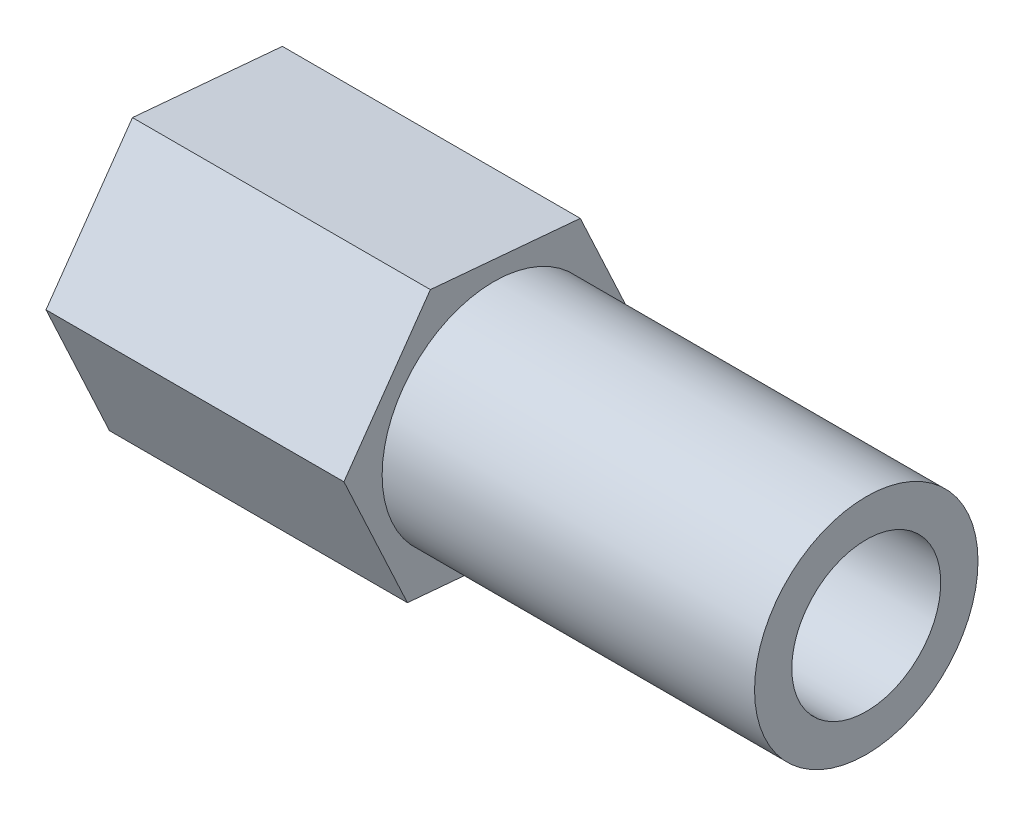
ISO-10303-21;
HEADER;
FILE_DESCRIPTION(('STEP AP214'),'2;1');
FILE_NAME('part.step','',(''),(''),'','','');
FILE_SCHEMA(('AUTOMOTIVE_DESIGN { 1 0 10303 214 1 1 1 1 }'));
ENDSEC;
DATA;
#1=APPLICATION_CONTEXT('core data for automotive mechanical design processes');
#2=APPLICATION_PROTOCOL_DEFINITION('international standard','automotive_design',2000,#1);
#3=PRODUCT_CONTEXT('',#1,'mechanical');
#4=PRODUCT('Part','Part','',(#3));
#5=PRODUCT_RELATED_PRODUCT_CATEGORY('part','',(#4));
#6=PRODUCT_DEFINITION_FORMATION('','',#4);
#7=PRODUCT_DEFINITION_CONTEXT('part definition',#1,'design');
#8=PRODUCT_DEFINITION('design','',#6,#7);
#9=PRODUCT_DEFINITION_SHAPE('','',#8);
#10=(LENGTH_UNIT() NAMED_UNIT(*) SI_UNIT(.MILLI.,.METRE.));
#11=(NAMED_UNIT(*) PLANE_ANGLE_UNIT() SI_UNIT($,.RADIAN.));
#12=(NAMED_UNIT(*) SI_UNIT($,.STERADIAN.) SOLID_ANGLE_UNIT());
#13=UNCERTAINTY_MEASURE_WITH_UNIT(LENGTH_MEASURE(1.E-05),#10,'distance_accuracy_value','');
#14=(GEOMETRIC_REPRESENTATION_CONTEXT(3) GLOBAL_UNCERTAINTY_ASSIGNED_CONTEXT((#13)) GLOBAL_UNIT_ASSIGNED_CONTEXT((#10,
#11,#12)) REPRESENTATION_CONTEXT('',''));
#15=CARTESIAN_POINT('',(0.,0.,0.));
#16=DIRECTION('',(0.,0.,1.));
#17=DIRECTION('',(1.,0.,0.));
#18=AXIS2_PLACEMENT_3D('',#15,#16,#17);
#19=CARTESIAN_POINT('',(8.,0.,0.));
#20=DIRECTION('',(1.,0.,0.));
#21=DIRECTION('',(0.,0.,-1.));
#22=AXIS2_PLACEMENT_3D('',#19,#20,#21);
#23=PLANE('',#22);
#24=DIRECTION('',(0.,-0.0881213424994462,-0.996109747465657));
#25=VECTOR('',#24,1.);
#26=CARTESIAN_POINT('',(8.,-3.30831503328289,2.32128950669405));
#27=LINE('',#26,#25);
#28=CARTESIAN_POINT('',(8.,-3.30831503328289,2.32128950669405));
#29=VERTEX_POINT('',#28);
#30=CARTESIAN_POINT('',(8.,-3.66445319897674,-1.70444010919791));
#31=VERTEX_POINT('',#30);
#32=EDGE_CURVE('E136',#29,#31,#27,.T.);
#33=ORIENTED_EDGE('',*,*,#32,.T.);
#34=DIRECTION('',(0.,0.818595675012837,-0.574370194952939));
#35=VECTOR('',#34,1.);
#36=CARTESIAN_POINT('',(8.,-3.66445319897674,-1.70444010919791));
#37=LINE('',#36,#35);
#38=CARTESIAN_POINT('',(8.,-0.356138165693851,-4.02572961589196));
#39=VERTEX_POINT('',#38);
#40=EDGE_CURVE('E94',#31,#39,#37,.T.);
#41=ORIENTED_EDGE('',*,*,#40,.T.);
#42=DIRECTION('',(0.,0.906717017512285,0.421739552512718));
#43=VECTOR('',#42,1.);
#44=CARTESIAN_POINT('',(8.,-0.356138165693851,-4.02572961589196));
#45=LINE('',#44,#43);
#46=CARTESIAN_POINT('',(8.,3.30831503328289,-2.32128950669404));
#47=VERTEX_POINT('',#46);
#48=EDGE_CURVE('E107',#39,#47,#45,.T.);
#49=ORIENTED_EDGE('',*,*,#48,.T.);
#50=DIRECTION('',(0.,0.0881213424994472,0.996109747465657));
#51=VECTOR('',#50,1.);
#52=CARTESIAN_POINT('',(8.,3.30831503328289,-2.32128950669404));
#53=LINE('',#52,#51);
#54=CARTESIAN_POINT('',(8.,3.66445319897674,1.70444010919791));
#55=VERTEX_POINT('',#54);
#56=EDGE_CURVE('E101',#47,#55,#53,.T.);
#57=ORIENTED_EDGE('',*,*,#56,.T.);
#58=DIRECTION('',(0.,-0.818595675012837,0.574370194952939));
#59=VECTOR('',#58,1.);
#60=CARTESIAN_POINT('',(8.,3.66445319897674,1.70444010919791));
#61=LINE('',#60,#59);
#62=CARTESIAN_POINT('',(8.,0.35613816569385,4.02572961589196));
#63=VERTEX_POINT('',#62);
#64=EDGE_CURVE('E105',#55,#63,#61,.T.);
#65=ORIENTED_EDGE('',*,*,#64,.T.);
#66=DIRECTION('',(0.,-0.906717017512285,-0.421739552512718));
#67=VECTOR('',#66,1.);
#68=CARTESIAN_POINT('',(8.,0.35613816569385,4.02572961589196));
#69=LINE('',#68,#67);
#70=EDGE_CURVE('E57',#63,#29,#69,.T.);
#71=ORIENTED_EDGE('',*,*,#70,.T.);
#72=EDGE_LOOP('',(#33,#41,#49,#57,#65,#71));
#73=FACE_BOUND('',#72,.T.);
#74=CARTESIAN_POINT('',(8.,0.,0.));
#75=DIRECTION('',(1.,0.,0.));
#76=DIRECTION('',(0.,0.,-1.));
#77=AXIS2_PLACEMENT_3D('',#74,#75,#76);
#78=CIRCLE('',#77,3.);
#79=CARTESIAN_POINT('',(8.,0.,-3.));
#80=VERTEX_POINT('',#79);
#81=EDGE_CURVE('E203',#80,#80,#78,.T.);
#82=ORIENTED_EDGE('',*,*,#81,.F.);
#83=EDGE_LOOP('',(#82));
#84=FACE_BOUND('',#83,.T.);
#85=ADVANCED_FACE('F35',(#73,#84),#23,.T.);
#86=CARTESIAN_POINT('',(8.,-3.30831503328289,2.32128950669405));
#87=DIRECTION('',(0.,0.996109747465657,-0.0881213424994462));
#88=DIRECTION('',(0.,0.0881213424994462,0.996109747465657));
#89=AXIS2_PLACEMENT_3D('',#86,#87,#88);
#90=PLANE('',#89);
#91=DIRECTION('',(0.,-0.0881213424994462,-0.996109747465657));
#92=VECTOR('',#91,1.);
#93=CARTESIAN_POINT('',(0.,-3.30831503328289,2.32128950669405));
#94=LINE('',#93,#92);
#95=CARTESIAN_POINT('',(0.,-3.30831503328289,2.32128950669405));
#96=VERTEX_POINT('',#95);
#97=CARTESIAN_POINT('',(0.,-3.66445319897674,-1.70444010919791));
#98=VERTEX_POINT('',#97);
#99=EDGE_CURVE('E125',#96,#98,#94,.T.);
#100=ORIENTED_EDGE('',*,*,#99,.T.);
#101=DIRECTION('',(-1.,0.,0.));
#102=VECTOR('',#101,1.);
#103=CARTESIAN_POINT('',(8.,-3.66445319897674,-1.70444010919791));
#104=LINE('',#103,#102);
#105=EDGE_CURVE('E11',#31,#98,#104,.T.);
#106=ORIENTED_EDGE('',*,*,#105,.F.);
#107=ORIENTED_EDGE('',*,*,#32,.F.);
#108=DIRECTION('',(-1.,0.,0.));
#109=VECTOR('',#108,1.);
#110=CARTESIAN_POINT('',(8.,-3.30831503328289,2.32128950669405));
#111=LINE('',#110,#109);
#112=EDGE_CURVE('E121',#29,#96,#111,.T.);
#113=ORIENTED_EDGE('',*,*,#112,.T.);
#114=EDGE_LOOP('',(#100,#106,#107,#113));
#115=FACE_BOUND('',#114,.T.);
#116=ADVANCED_FACE('F37',(#115),#90,.F.);
#117=CARTESIAN_POINT('',(8.,-3.66445319897674,-1.70444010919791));
#118=DIRECTION('',(0.,0.574370194952939,0.818595675012837));
#119=DIRECTION('',(0.,-0.818595675012837,0.574370194952939));
#120=AXIS2_PLACEMENT_3D('',#117,#118,#119);
#121=PLANE('',#120);
#122=DIRECTION('',(0.,0.818595675012837,-0.574370194952939));
#123=VECTOR('',#122,1.);
#124=CARTESIAN_POINT('',(0.,-3.66445319897674,-1.70444010919791));
#125=LINE('',#124,#123);
#126=CARTESIAN_POINT('',(0.,-0.356138165693851,-4.02572961589196));
#127=VERTEX_POINT('',#126);
#128=EDGE_CURVE('E128',#98,#127,#125,.T.);
#129=ORIENTED_EDGE('',*,*,#128,.T.);
#130=DIRECTION('',(-1.,0.,0.));
#131=VECTOR('',#130,1.);
#132=CARTESIAN_POINT('',(8.,-0.356138165693851,-4.02572961589196));
#133=LINE('',#132,#131);
#134=EDGE_CURVE('E49',#39,#127,#133,.T.);
#135=ORIENTED_EDGE('',*,*,#134,.F.);
#136=ORIENTED_EDGE('',*,*,#40,.F.);
#137=ORIENTED_EDGE('',*,*,#105,.T.);
#138=EDGE_LOOP('',(#129,#135,#136,#137));
#139=FACE_BOUND('',#138,.T.);
#140=ADVANCED_FACE('F166',(#139),#121,.F.);
#141=CARTESIAN_POINT('',(8.,-0.356138165693851,-4.02572961589196));
#142=DIRECTION('',(0.,-0.421739552512718,0.906717017512285));
#143=DIRECTION('',(0.,-0.906717017512285,-0.421739552512718));
#144=AXIS2_PLACEMENT_3D('',#141,#142,#143);
#145=PLANE('',#144);
#146=DIRECTION('',(0.,0.906717017512285,0.421739552512718));
#147=VECTOR('',#146,1.);
#148=CARTESIAN_POINT('',(0.,-0.356138165693851,-4.02572961589196));
#149=LINE('',#148,#147);
#150=CARTESIAN_POINT('',(0.,3.30831503328289,-2.32128950669404));
#151=VERTEX_POINT('',#150);
#152=EDGE_CURVE('E131',#127,#151,#149,.T.);
#153=ORIENTED_EDGE('',*,*,#152,.T.);
#154=DIRECTION('',(-1.,0.,0.));
#155=VECTOR('',#154,1.);
#156=CARTESIAN_POINT('',(8.,3.30831503328289,-2.32128950669404));
#157=LINE('',#156,#155);
#158=EDGE_CURVE('E116',#47,#151,#157,.T.);
#159=ORIENTED_EDGE('',*,*,#158,.F.);
#160=ORIENTED_EDGE('',*,*,#48,.F.);
#161=ORIENTED_EDGE('',*,*,#134,.T.);
#162=EDGE_LOOP('',(#153,#159,#160,#161));
#163=FACE_BOUND('',#162,.T.);
#164=ADVANCED_FACE('F143',(#163),#145,.F.);
#165=CARTESIAN_POINT('',(8.,3.30831503328289,-2.32128950669404));
#166=DIRECTION('',(0.,-0.996109747465657,0.0881213424994472));
#167=DIRECTION('',(0.,-0.0881213424994472,-0.996109747465657));
#168=AXIS2_PLACEMENT_3D('',#165,#166,#167);
#169=PLANE('',#168);
#170=DIRECTION('',(0.,0.0881213424994472,0.996109747465657));
#171=VECTOR('',#170,1.);
#172=CARTESIAN_POINT('',(0.,3.30831503328289,-2.32128950669404));
#173=LINE('',#172,#171);
#174=CARTESIAN_POINT('',(0.,3.66445319897674,1.70444010919791));
#175=VERTEX_POINT('',#174);
#176=EDGE_CURVE('E115',#151,#175,#173,.T.);
#177=ORIENTED_EDGE('',*,*,#176,.T.);
#178=DIRECTION('',(-1.,0.,0.));
#179=VECTOR('',#178,1.);
#180=CARTESIAN_POINT('',(8.,3.66445319897674,1.70444010919791));
#181=LINE('',#180,#179);
#182=EDGE_CURVE('E112',#55,#175,#181,.T.);
#183=ORIENTED_EDGE('',*,*,#182,.F.);
#184=ORIENTED_EDGE('',*,*,#56,.F.);
#185=ORIENTED_EDGE('',*,*,#158,.T.);
#186=EDGE_LOOP('',(#177,#183,#184,#185));
#187=FACE_BOUND('',#186,.T.);
#188=ADVANCED_FACE('F113',(#187),#169,.F.);
#189=CARTESIAN_POINT('',(8.,3.66445319897674,1.70444010919791));
#190=DIRECTION('',(0.,-0.574370194952939,-0.818595675012837));
#191=DIRECTION('',(0.,0.818595675012837,-0.574370194952939));
#192=AXIS2_PLACEMENT_3D('',#189,#190,#191);
#193=PLANE('',#192);
#194=DIRECTION('',(0.,-0.818595675012837,0.574370194952939));
#195=VECTOR('',#194,1.);
#196=CARTESIAN_POINT('',(0.,3.66445319897674,1.70444010919791));
#197=LINE('',#196,#195);
#198=CARTESIAN_POINT('',(0.,0.35613816569385,4.02572961589196));
#199=VERTEX_POINT('',#198);
#200=EDGE_CURVE('E80',#175,#199,#197,.T.);
#201=ORIENTED_EDGE('',*,*,#200,.T.);
#202=DIRECTION('',(-1.,0.,0.));
#203=VECTOR('',#202,1.);
#204=CARTESIAN_POINT('',(8.,0.35613816569385,4.02572961589196));
#205=LINE('',#204,#203);
#206=EDGE_CURVE('E117',#63,#199,#205,.T.);
#207=ORIENTED_EDGE('',*,*,#206,.F.);
#208=ORIENTED_EDGE('',*,*,#64,.F.);
#209=ORIENTED_EDGE('',*,*,#182,.T.);
#210=EDGE_LOOP('',(#201,#207,#208,#209));
#211=FACE_BOUND('',#210,.T.);
#212=ADVANCED_FACE('F119',(#211),#193,.F.);
#213=CARTESIAN_POINT('',(8.,0.35613816569385,4.02572961589196));
#214=DIRECTION('',(0.,0.421739552512718,-0.906717017512285));
#215=DIRECTION('',(0.,0.906717017512285,0.421739552512718));
#216=AXIS2_PLACEMENT_3D('',#213,#214,#215);
#217=PLANE('',#216);
#218=DIRECTION('',(0.,-0.906717017512285,-0.421739552512718));
#219=VECTOR('',#218,1.);
#220=CARTESIAN_POINT('',(0.,0.35613816569385,4.02572961589196));
#221=LINE('',#220,#219);
#222=EDGE_CURVE('E86',#199,#96,#221,.T.);
#223=ORIENTED_EDGE('',*,*,#222,.T.);
#224=ORIENTED_EDGE('',*,*,#112,.F.);
#225=ORIENTED_EDGE('',*,*,#70,.F.);
#226=ORIENTED_EDGE('',*,*,#206,.T.);
#227=EDGE_LOOP('',(#223,#224,#225,#226));
#228=FACE_BOUND('',#227,.T.);
#229=ADVANCED_FACE('F150',(#228),#217,.F.);
#230=CARTESIAN_POINT('',(0.,0.,0.));
#231=DIRECTION('',(1.,0.,0.));
#232=DIRECTION('',(0.,0.,-1.));
#233=AXIS2_PLACEMENT_3D('',#230,#231,#232);
#234=PLANE('',#233);
#235=CARTESIAN_POINT('',(0.,0.,0.));
#236=DIRECTION('',(-1.,0.,0.));
#237=DIRECTION('',(0.,0.,1.));
#238=AXIS2_PLACEMENT_3D('',#235,#236,#237);
#239=CIRCLE('',#238,2.);
#240=CARTESIAN_POINT('',(0.,0.,2.));
#241=VERTEX_POINT('',#240);
#242=EDGE_CURVE('E179',#241,#241,#239,.T.);
#243=ORIENTED_EDGE('',*,*,#242,.F.);
#244=EDGE_LOOP('',(#243));
#245=FACE_BOUND('',#244,.T.);
#246=ORIENTED_EDGE('',*,*,#99,.F.);
#247=ORIENTED_EDGE('',*,*,#222,.F.);
#248=ORIENTED_EDGE('',*,*,#200,.F.);
#249=ORIENTED_EDGE('',*,*,#176,.F.);
#250=ORIENTED_EDGE('',*,*,#152,.F.);
#251=ORIENTED_EDGE('',*,*,#128,.F.);
#252=EDGE_LOOP('',(#246,#247,#248,#249,#250,#251));
#253=FACE_BOUND('',#252,.T.);
#254=ADVANCED_FACE('F146',(#245,#253),#234,.F.);
#255=CARTESIAN_POINT('',(18.,0.,0.));
#256=DIRECTION('',(-1.,0.,0.));
#257=DIRECTION('',(0.,0.,1.));
#258=AXIS2_PLACEMENT_3D('',#255,#256,#257);
#259=CYLINDRICAL_SURFACE('',#258,3.);
#260=CARTESIAN_POINT('',(14.5783428836509,0.,-3.));
#261=CARTESIAN_POINT('',(14.5783379301751,0.0788579444268503,-2.99999570107562));
#262=CARTESIAN_POINT('',(14.5720877739693,0.157809899546344,-2.99685736529635));
#263=CARTESIAN_POINT('',(14.5473635631385,0.313380352903344,-2.98461234055736));
#264=CARTESIAN_POINT('',(14.5288662941541,0.389994130070445,-2.97549431743379));
#265=CARTESIAN_POINT('',(14.4805521707259,0.538400317320674,-2.95224419105063));
#266=CARTESIAN_POINT('',(14.4507793072789,0.61021020440872,-2.93813158766306));
#267=CARTESIAN_POINT('',(14.3809869516034,0.747708925209899,-2.90618664773642));
#268=CARTESIAN_POINT('',(14.3409682672776,0.813398240985089,-2.88835460450288));
#269=CARTESIAN_POINT('',(14.2490670094229,0.941261726642864,-2.84934387387093));
#270=CARTESIAN_POINT('',(14.1966131647914,1.00298281668316,-2.82802798691306));
#271=CARTESIAN_POINT('',(14.0825606647803,1.11716916730047,-2.78489955370114));
#272=CARTESIAN_POINT('',(14.0209551059922,1.16962737466015,-2.76308664313552));
#273=CARTESIAN_POINT('',(13.8846178593658,1.26787800067542,-2.71948426796021));
#274=CARTESIAN_POINT('',(13.809238736132,1.31283800332746,-2.69782780455198));
#275=CARTESIAN_POINT('',(13.6507918796715,1.38925234033604,-2.65928968158481));
#276=CARTESIAN_POINT('',(13.5677296905667,1.4207163224495,-2.64240461410484));
#277=CARTESIAN_POINT('',(13.401345225518,1.46719866328288,-2.61686800556713));
#278=CARTESIAN_POINT('',(13.3183362055498,1.48308878562066,-2.6077840737557));
#279=CARTESIAN_POINT('',(13.1503746269816,1.50064048996327,-2.59772834922792));
#280=CARTESIAN_POINT('',(13.0654240723441,1.50231613255961,-2.59674854014932));
#281=CARTESIAN_POINT('',(12.9069138471778,1.49203093075844,-2.60266395385873));
#282=CARTESIAN_POINT('',(12.8332068368163,1.48167683930523,-2.6086314549302));
#283=CARTESIAN_POINT('',(12.6887600195913,1.4504097735854,-2.62614343100775));
#284=CARTESIAN_POINT('',(12.6180211656929,1.42949343584648,-2.63768968247664));
#285=CARTESIAN_POINT('',(12.4794991848024,1.37731467057901,-2.66531214619112));
#286=CARTESIAN_POINT('',(12.4118232854722,1.34582260067399,-2.68148760995998));
#287=CARTESIAN_POINT('',(12.2823914447658,1.273562531502,-2.71655106422106));
#288=CARTESIAN_POINT('',(12.2206381802507,1.2327903657187,-2.73544027170286));
#289=CARTESIAN_POINT('',(12.096561004536,1.13709908236918,-2.77669736854929));
#290=CARTESIAN_POINT('',(12.0351575732866,1.08104168755392,-2.79920265355119));
#291=CARTESIAN_POINT('',(11.9222397557645,0.95933336811206,-2.84321434950611));
#292=CARTESIAN_POINT('',(11.8707300956,0.893677884861428,-2.86472027938201));
#293=CARTESIAN_POINT('',(11.7768143921063,0.750774758747772,-2.90552980924446));
#294=CARTESIAN_POINT('',(11.7349421749822,0.673130387399113,-2.92468476243011));
#295=CARTESIAN_POINT('',(11.6651973400863,0.510699323233195,-2.95736821681863));
#296=CARTESIAN_POINT('',(11.6373136061281,0.425918364397914,-2.9709011841533));
#297=CARTESIAN_POINT('',(11.5986297780758,0.259149737491053,-2.98986500612153));
#298=CARTESIAN_POINT('',(11.5866060300307,0.177512295822489,-2.99587407451965));
#299=CARTESIAN_POINT('',(11.5761457869491,0.0131693999240273,-3.00109520188655));
#300=CARTESIAN_POINT('',(11.5777028551916,-0.0695355298048631,-3.00031048081978));
#301=CARTESIAN_POINT('',(11.593652916279,-0.22684945797898,-2.99236788380152));
#302=CARTESIAN_POINT('',(11.6070416827458,-0.301589112074894,-2.98570868532253));
#303=CARTESIAN_POINT('',(11.6446999914935,-0.447610338452911,-2.9673325697226));
#304=CARTESIAN_POINT('',(11.6689707333311,-0.51889152853663,-2.95561509501618));
#305=CARTESIAN_POINT('',(11.7283405833004,-0.658332912674359,-2.92776377120382));
#306=CARTESIAN_POINT('',(11.7637294588253,-0.726345595508705,-2.91151322654446));
#307=CARTESIAN_POINT('',(11.8440041871207,-0.855692042548907,-2.87615961476126));
#308=CARTESIAN_POINT('',(11.8888940855439,-0.917022944664887,-2.85705533350407));
#309=CARTESIAN_POINT('',(11.9919835216469,-1.03765153393382,-2.81562332004297));
#310=CARTESIAN_POINT('',(12.0510571863186,-1.09615811672854,-2.79316327265249));
#311=CARTESIAN_POINT('',(12.1782306105674,-1.20278448167828,-2.7489358741323));
#312=CARTESIAN_POINT('',(12.2463365619227,-1.25089707856781,-2.72716901100071));
#313=CARTESIAN_POINT('',(12.3938083649103,-1.33756187171853,-2.68576788309734));
#314=CARTESIAN_POINT('',(12.4735597827926,-1.37553824370037,-2.66628794383591));
#315=CARTESIAN_POINT('',(12.6396079850133,-1.43712423890206,-2.63361108441202));
#316=CARTESIAN_POINT('',(12.7258961733512,-1.46075237380052,-2.62040607332625));
#317=CARTESIAN_POINT('',(12.8937082179779,-1.49079253120031,-2.60342251538703));
#318=CARTESIAN_POINT('',(12.9748942638037,-1.49863949460818,-2.59886075197597));
#319=CARTESIAN_POINT('',(13.1375134843976,-1.5010337315643,-2.59748031962405));
#320=CARTESIAN_POINT('',(13.2189465367576,-1.49558676993486,-2.60065829439585));
#321=CARTESIAN_POINT('',(13.371568135951,-1.47288918838997,-2.61356793076615));
#322=CARTESIAN_POINT('',(13.442993588868,-1.45681247151455,-2.62264641723988));
#323=CARTESIAN_POINT('',(13.5820550627874,-1.41476303733662,-2.64556524281479));
#324=CARTESIAN_POINT('',(13.6496898567889,-1.38878713673988,-2.65940711354503));
#325=CARTESIAN_POINT('',(13.7842801601307,-1.32572361795085,-2.69142795546803));
#326=CARTESIAN_POINT('',(13.8508847363944,-1.28800670672355,-2.70983583593881));
#327=CARTESIAN_POINT('',(13.9772546879227,-1.20322645745609,-2.74852997452291));
#328=CARTESIAN_POINT('',(14.0370164794325,-1.15615825686234,-2.76881720693416));
#329=CARTESIAN_POINT('',(14.1555558571829,-1.04730498999206,-2.81193484737138));
#330=CARTESIAN_POINT('',(14.2133315371763,-0.984426634495894,-2.83477474959942));
#331=CARTESIAN_POINT('',(14.3177373588038,-0.849232209349798,-2.87816628389896));
#332=CARTESIAN_POINT('',(14.3643614928557,-0.776911084957797,-2.89871667939293));
#333=CARTESIAN_POINT('',(14.445197427719,-0.62389739517442,-2.93547014349806));
#334=CARTESIAN_POINT('',(14.4793191375056,-0.543149255665097,-2.95164144740899));
#335=CARTESIAN_POINT('',(14.533055135287,-0.376113151707131,-2.9775201194848));
#336=CARTESIAN_POINT('',(14.5527106538594,-0.289841699383651,-2.98724585044602));
#337=CARTESIAN_POINT('',(14.5691890002795,-0.168902919736344,-2.99543192870217));
#338=CARTESIAN_POINT('',(14.5726168449504,-0.135242819162348,-2.99714048010376));
#339=CARTESIAN_POINT('',(14.577194881922,-0.0677275977076378,-2.99942545465223));
#340=CARTESIAN_POINT('',(14.5783450113562,-0.0338724714699429,-3.00000184655071));
#341=CARTESIAN_POINT('',(14.5783428836509,0.,-3.));
#342=B_SPLINE_CURVE_WITH_KNOTS('',3,(#260,#261,#262,#263,#264,#265,#266,#267,#268,#269,#270,
#271,#272,#273,#274,#275,#276,#277,#278,#279,#280,#281,#282,#283,#284,#285,#286,#287,#288,#289,
#290,#291,#292,#293,#294,#295,#296,#297,#298,#299,#300,#301,#302,#303,#304,#305,#306,#307,#308,
#309,#310,#311,#312,#313,#314,#315,#316,#317,#318,#319,#320,#321,#322,#323,#324,#325,#326,#327,
#328,#329,#330,#331,#332,#333,#334,#335,#336,#337,#338,#339,#340,#341),.UNSPECIFIED.,.T.,.F.,(4,
2,2,2,2,2,2,2,2,2,2,2,2,2,2,2,2,2,2,2,2,2,2,2,2,2,2,2,2,2,2,2,2,2,2,2,2,2,2,2,4),(0.,
0.236436386130439,0.473322224563797,0.709293233238449,0.945245640872352,1.19547263807713,
1.44588935648105,1.71572589646129,1.98536921847421,2.23887018210344,2.49212035993531,
2.71508568613981,2.93812205888518,3.16635360252731,3.39468781890333,3.65197412000818,
3.9093830189803,4.17874533321661,4.44789325368419,4.69474935707018,4.94148846767214,
5.16910359759183,5.39674382446397,5.63089284041848,5.86514176122509,6.12239415966628,
6.37982382923148,6.64972023242589,6.91926767918176,7.1629396125457,7.40650589797017,
7.62686895373283,7.84730293182526,8.0825468517043,8.31791341715446,8.58187864135757,
8.84598575071868,9.1119602049529,9.37717362931724,9.47872920200875,9.58028757766599),.UNSPECIFIED.);
#343=CARTESIAN_POINT('',(14.5783428836509,0.,-3.));
#344=VERTEX_POINT('',#343);
#345=EDGE_CURVE('E174',#344,#344,#342,.T.);
#346=ORIENTED_EDGE('',*,*,#345,.T.);
#347=EDGE_LOOP('',(#346));
#348=FACE_BOUND('',#347,.T.);
#349=CARTESIAN_POINT('',(18.,0.,0.));
#350=DIRECTION('',(1.,0.,0.));
#351=DIRECTION('',(0.,0.,-1.));
#352=AXIS2_PLACEMENT_3D('',#349,#350,#351);
#353=CIRCLE('',#352,3.);
#354=CARTESIAN_POINT('',(18.,0.,-3.));
#355=VERTEX_POINT('',#354);
#356=EDGE_CURVE('E129',#355,#355,#353,.T.);
#357=ORIENTED_EDGE('',*,*,#356,.F.);
#358=EDGE_LOOP('',(#357));
#359=FACE_BOUND('',#358,.T.);
#360=ORIENTED_EDGE('',*,*,#81,.T.);
#361=EDGE_LOOP('',(#360));
#362=FACE_BOUND('',#361,.T.);
#363=ADVANCED_FACE('F157',(#348,#359,#362),#259,.T.);
#364=CARTESIAN_POINT('',(18.,0.,0.));
#365=DIRECTION('',(1.,0.,0.));
#366=DIRECTION('',(0.,0.,-1.));
#367=AXIS2_PLACEMENT_3D('',#364,#365,#366);
#368=PLANE('',#367);
#369=CARTESIAN_POINT('',(18.,0.,0.));
#370=DIRECTION('',(-1.,0.,0.));
#371=DIRECTION('',(0.,0.,1.));
#372=AXIS2_PLACEMENT_3D('',#369,#370,#371);
#373=CIRCLE('',#372,2.);
#374=CARTESIAN_POINT('',(18.,0.,2.));
#375=VERTEX_POINT('',#374);
#376=EDGE_CURVE('E180',#375,#375,#373,.T.);
#377=ORIENTED_EDGE('',*,*,#376,.T.);
#378=EDGE_LOOP('',(#377));
#379=FACE_BOUND('',#378,.T.);
#380=ORIENTED_EDGE('',*,*,#356,.T.);
#381=EDGE_LOOP('',(#380));
#382=FACE_BOUND('',#381,.T.);
#383=ADVANCED_FACE('F171',(#379,#382),#368,.T.);
#384=CARTESIAN_POINT('',(18.,0.,0.));
#385=DIRECTION('',(-1.,0.,0.));
#386=DIRECTION('',(0.,0.,1.));
#387=AXIS2_PLACEMENT_3D('',#384,#385,#386);
#388=CYLINDRICAL_SURFACE('',#387,2.);
#389=CARTESIAN_POINT('',(14.5783428836509,0.,-2.));
#390=CARTESIAN_POINT('',(14.5783380916388,-0.0732207358411543,-1.99999540196395));
#391=CARTESIAN_POINT('',(14.5729378592764,-0.146561062021485,-1.99593645526274));
#392=CARTESIAN_POINT('',(14.5516758202407,-0.290936396286467,-1.98006607281083));
#393=CARTESIAN_POINT('',(14.5357877120008,-0.361965136229004,-1.96823514679854));
#394=CARTESIAN_POINT('',(14.4946299743671,-0.499234626631249,-1.9379567495606));
#395=CARTESIAN_POINT('',(14.4694173700817,-0.565501615403737,-1.91954951932009));
#396=CARTESIAN_POINT('',(14.4108005394636,-0.692422335520753,-1.87750556721694));
#397=CARTESIAN_POINT('',(14.3773987094573,-0.753077701796332,-1.85387037535483));
#398=CARTESIAN_POINT('',(14.30007987206,-0.873465937590145,-1.80049544543983));
#399=CARTESIAN_POINT('',(14.2554755543168,-0.932593229272032,-1.77039308548439));
#400=CARTESIAN_POINT('',(14.1588470462897,-1.04302716767671,-1.70767017883378));
#401=CARTESIAN_POINT('',(14.106811400851,-1.09432148272226,-1.67504578078609));
#402=CARTESIAN_POINT('',(13.9847599303725,-1.19837161436623,-1.6027112365199));
#403=CARTESIAN_POINT('',(13.9132392065291,-1.24930578421204,-1.56290854864639));
#404=CARTESIAN_POINT('',(13.7608918712843,-1.33861998176348,-1.48711444664135));
#405=CARTESIAN_POINT('',(13.6800781866505,-1.37701716983077,-1.45111786883675));
#406=CARTESIAN_POINT('',(13.5388400449746,-1.42880627811788,-1.39977155180179));
#407=CARTESIAN_POINT('',(13.4809521865225,-1.44625674456539,-1.38157751186733));
#408=CARTESIAN_POINT('',(13.3619501488659,-1.47420672564844,-1.35171594150685));
#409=CARTESIAN_POINT('',(13.3008437057761,-1.48472215355267,-1.34003347910832));
#410=CARTESIAN_POINT('',(13.1761602981201,-1.49812822141445,-1.32503759684553));
#411=CARTESIAN_POINT('',(13.1125660769268,-1.50094954854207,-1.32180026676597));
#412=CARTESIAN_POINT('',(12.9857279727693,-1.49848213241869,-1.32459531776068));
#413=CARTESIAN_POINT('',(12.9224842235634,-1.49319048157349,-1.33063102218113));
#414=CARTESIAN_POINT('',(12.8051515362251,-1.47597739291882,-1.34967623262519));
#415=CARTESIAN_POINT('',(12.7508065126047,-1.46482486380817,-1.36187157059871));
#416=CARTESIAN_POINT('',(12.64490400493,-1.43705671120733,-1.39114192844939));
#417=CARTESIAN_POINT('',(12.5933492558273,-1.42043583681172,-1.40822163640769));
#418=CARTESIAN_POINT('',(12.4620864970167,-1.37033064172535,-1.45741769294306));
#419=CARTESIAN_POINT('',(12.3849424670073,-1.3328014849398,-1.49225649139232));
#420=CARTESIAN_POINT('',(12.2391463597818,-1.24618023314519,-1.56533298145196));
#421=CARTESIAN_POINT('',(12.1705155443962,-1.19706004255879,-1.60357878886109));
#422=CARTESIAN_POINT('',(12.0405894932472,-1.08651604102136,-1.68051672313145));
#423=CARTESIAN_POINT('',(11.9795222767694,-1.02481375526037,-1.71919586730239));
#424=CARTESIAN_POINT('',(11.8680792368697,-0.890422521709594,-1.79248037980972));
#425=CARTESIAN_POINT('',(11.8176829634205,-0.817755054293761,-1.8270934826376));
#426=CARTESIAN_POINT('',(11.7383620844105,-0.677902080454148,-1.88279726073643));
#427=CARTESIAN_POINT('',(11.7071582894351,-0.612539870185625,-1.90520770945008));
#428=CARTESIAN_POINT('',(11.654118003187,-0.476352173202091,-1.94372904416948));
#429=CARTESIAN_POINT('',(11.6322756451516,-0.405530141063771,-1.95984387504352));
#430=CARTESIAN_POINT('',(11.5990895207644,-0.259676232483524,-1.98445588635989));
#431=CARTESIAN_POINT('',(11.5878107047122,-0.184621281405948,-1.99290592971749));
#432=CARTESIAN_POINT('',(11.5767932862791,-0.0332012397969219,-2.00115883659445));
#433=CARTESIAN_POINT('',(11.5770498149555,0.0431632843727187,-2.00096534845408));
#434=CARTESIAN_POINT('',(11.588453752924,0.186804217329621,-1.99242547175873));
#435=CARTESIAN_POINT('',(11.5985034205395,0.254222327546129,-1.98490086600401));
#436=CARTESIAN_POINT('',(11.6273166636587,0.386110670609114,-1.96351320201588));
#437=CARTESIAN_POINT('',(11.6460820933403,0.450580272987257,-1.94964879507262));
#438=CARTESIAN_POINT('',(11.6922304142439,0.577416779689765,-1.91599830683313));
#439=CARTESIAN_POINT('',(11.7198940650782,0.639629172536134,-1.89602050290194));
#440=CARTESIAN_POINT('',(11.7825153390764,0.758518527043068,-1.85166985411963));
#441=CARTESIAN_POINT('',(11.8174739712906,0.815194721336399,-1.82729640132068));
#442=CARTESIAN_POINT('',(11.9001261300614,0.931511626319033,-1.77119146886499));
#443=CARTESIAN_POINT('',(11.9489714230883,0.990066762698697,-1.73891095025037));
#444=CARTESIAN_POINT('',(12.0543516362392,1.09871974855853,-1.67238952874785));
#445=CARTESIAN_POINT('',(12.1109035833442,1.14879830469576,-1.63814438507395));
#446=CARTESIAN_POINT('',(12.242492764612,1.24877541075626,-1.56369128291497));
#447=CARTESIAN_POINT('',(12.3190004451431,1.29683043648704,-1.52358718520101));
#448=CARTESIAN_POINT('',(12.4817029616233,1.37923235998282,-1.44940591348451));
#449=CARTESIAN_POINT('',(12.5678680055594,1.41362000515519,-1.41531099570969));
#450=CARTESIAN_POINT('',(12.7137573325253,1.45615734256767,-1.37118877808583));
#451=CARTESIAN_POINT('',(12.7707340100532,1.46931009512996,-1.35695811824565));
#452=CARTESIAN_POINT('',(12.887049930634,1.48891522181906,-1.33542056103011));
#453=CARTESIAN_POINT('',(12.9463835904531,1.4953825519924,-1.32809821220233));
#454=CARTESIAN_POINT('',(13.0661719634622,1.50115320209064,-1.32157601792209));
#455=CARTESIAN_POINT('',(13.1266308266604,1.50042015325262,-1.32241740684975));
#456=CARTESIAN_POINT('',(13.246399722403,1.49176883838219,-1.33216448543666));
#457=CARTESIAN_POINT('',(13.3057081715481,1.48384130024585,-1.34108058157484));
#458=CARTESIAN_POINT('',(13.4342574550616,1.45893841819723,-1.36817348797772));
#459=CARTESIAN_POINT('',(13.5028400637836,1.44036567954112,-1.38794705950643));
#460=CARTESIAN_POINT('',(13.6348777324813,1.39469627266119,-1.43382963385409));
#461=CARTESIAN_POINT('',(13.698319325689,1.3675780729773,-1.45995460146929));
#462=CARTESIAN_POINT('',(13.8408635141372,1.29498918933643,-1.52516477328823));
#463=CARTESIAN_POINT('',(13.9177644664066,1.24641542065971,-1.56560203191104));
#464=CARTESIAN_POINT('',(14.0614689286284,1.13650718465937,-1.64713510181272));
#465=CARTESIAN_POINT('',(14.1282633495957,1.07516134758578,-1.68823146954222));
#466=CARTESIAN_POINT('',(14.2511747259342,0.939627144937905,-1.76728988939793));
#467=CARTESIAN_POINT('',(14.307199203028,0.865337161562875,-1.80522333711071));
#468=CARTESIAN_POINT('',(14.4055659347962,0.705159098936219,-1.87357289668096));
#469=CARTESIAN_POINT('',(14.4479408582233,0.61929942040181,-1.90400691592958));
#470=CARTESIAN_POINT('',(14.5061423046366,0.464840290356471,-1.94636704624047));
#471=CARTESIAN_POINT('',(14.526109615027,0.39855361477475,-1.96110322499718));
#472=CARTESIAN_POINT('',(14.5567607862623,0.262841610392778,-1.98383739970237));
#473=CARTESIAN_POINT('',(14.5674705739008,0.193425623834924,-1.99185421210894));
#474=CARTESIAN_POINT('',(14.5749475778652,0.102963309861904,-1.99745471706309));
#475=CARTESIAN_POINT('',(14.5762191611403,0.0824069459941362,-1.9984076143208));
#476=CARTESIAN_POINT('',(14.5779175568818,0.0412368896243848,-1.99968095423138));
#477=CARTESIAN_POINT('',(14.5783442333582,0.0206231884283914,-2.00000129507253));
#478=CARTESIAN_POINT('',(14.5783428836509,0.,-2.));
#479=B_SPLINE_CURVE_WITH_KNOTS('',3,(#389,#390,#391,#392,#393,#394,#395,#396,#397,#398,#399,
#400,#401,#402,#403,#404,#405,#406,#407,#408,#409,#410,#411,#412,#413,#414,#415,#416,#417,#418,
#419,#420,#421,#422,#423,#424,#425,#426,#427,#428,#429,#430,#431,#432,#433,#434,#435,#436,#437,
#438,#439,#440,#441,#442,#443,#444,#445,#446,#447,#448,#449,#450,#451,#452,#453,#454,#455,#456,
#457,#458,#459,#460,#461,#462,#463,#464,#465,#466,#467,#468,#469,#470,#471,#472,#473,#474,#475,
#476,#477,#478),.UNSPECIFIED.,.T.,.F.,(4,2,2,2,2,2,2,2,2,2,2,2,2,2,2,2,2,2,2,2,2,2,2,2,2,2,2,2,
2,2,2,2,2,2,2,2,2,2,2,2,2,2,2,2,4),(0.,0.219571786572042,0.439696319423244,0.658496333573382,
0.877232398849292,1.1162243131743,1.35558868405163,1.64360015887451,1.93121574056507,
2.11999518529901,2.3083399319529,2.49837587621257,2.6884799430021,2.85826890162709,
3.02822137600639,3.30449331805909,3.58144192357889,3.8653588393809,4.1487266249369,
4.37526505006389,4.60166129643117,4.82944058166898,5.05712372466613,5.26191187011994,
5.46674360185812,5.67880439483679,5.8908945397754,6.13840382081867,6.38646908985451,
6.68168596015946,6.97601595850112,7.15589161422932,7.33536399114208,7.5157433385474,
7.69635548563853,7.91639670960133,8.1369968513992,8.43412246655766,8.73151372390891,
9.03135449492648,9.33047220273162,9.54195697541628,9.75284752283254,9.8146816687871,
9.87652576630966),.UNSPECIFIED.);
#480=CARTESIAN_POINT('',(14.5783428836509,0.,-2.));
#481=VERTEX_POINT('',#480);
#482=EDGE_CURVE('E39',#481,#481,#479,.T.);
#483=ORIENTED_EDGE('',*,*,#482,.T.);
#484=EDGE_LOOP('',(#483));
#485=FACE_BOUND('',#484,.T.);
#486=ORIENTED_EDGE('',*,*,#376,.F.);
#487=EDGE_LOOP('',(#486));
#488=FACE_BOUND('',#487,.T.);
#489=ORIENTED_EDGE('',*,*,#242,.T.);
#490=EDGE_LOOP('',(#489));
#491=FACE_BOUND('',#490,.T.);
#492=ADVANCED_FACE('F185',(#485,#488,#491),#388,.F.);
#493=CARTESIAN_POINT('',(13.0783428836508,0.,-10.));
#494=DIRECTION('',(0.,0.,1.));
#495=DIRECTION('',(1.,0.,0.));
#496=AXIS2_PLACEMENT_3D('',#493,#494,#495);
#497=CYLINDRICAL_SURFACE('',#496,1.5);
#498=ORIENTED_EDGE('',*,*,#482,.F.);
#499=EDGE_LOOP('',(#498));
#500=FACE_BOUND('',#499,.T.);
#501=ORIENTED_EDGE('',*,*,#345,.F.);
#502=EDGE_LOOP('',(#501));
#503=FACE_BOUND('',#502,.T.);
#504=ADVANCED_FACE('F182',(#500,#503),#497,.F.);
#505=CLOSED_SHELL('',(#85,#116,#140,#164,#188,#212,#229,#254,#363,#383,#492,#504));
#506=MANIFOLD_SOLID_BREP('B2',#505);
#507=ADVANCED_BREP_SHAPE_REPRESENTATION('',(#18,#506),#14);
#508=SHAPE_DEFINITION_REPRESENTATION(#9,#507);
ENDSEC;
END-ISO-10303-21;
